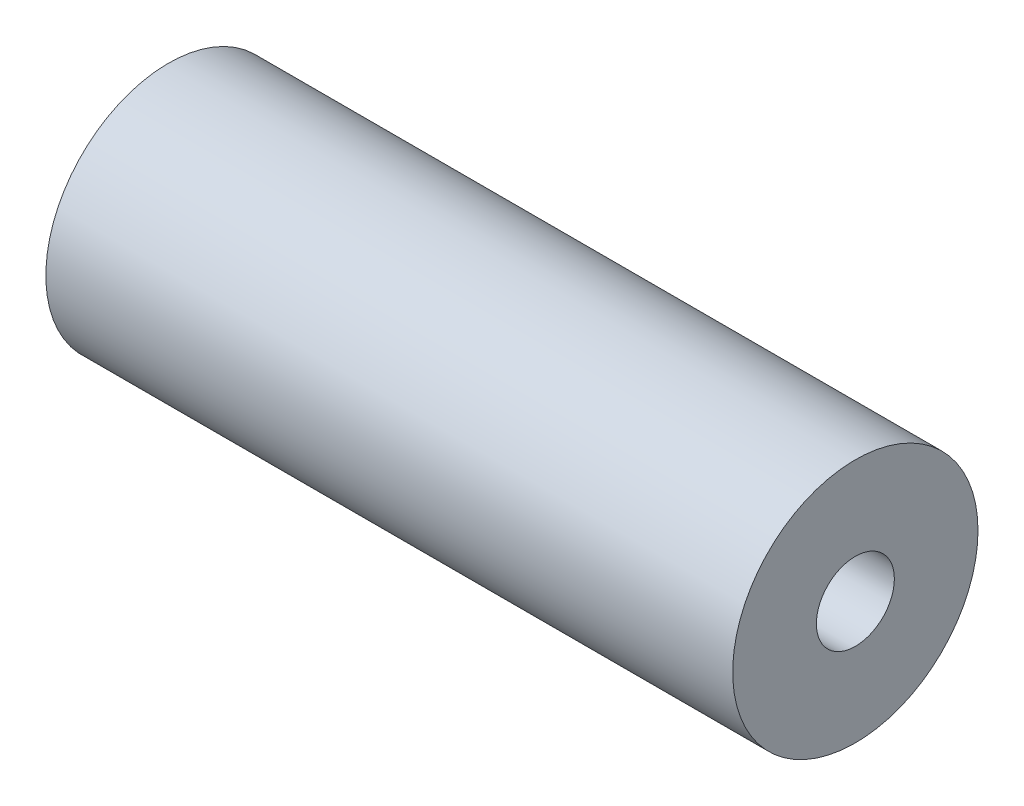
ISO-10303-21;
HEADER;
FILE_DESCRIPTION(('STEP AP214'),'2;1');
FILE_NAME('part.step','',(''),(''),'','','');
FILE_SCHEMA(('AUTOMOTIVE_DESIGN { 1 0 10303 214 1 1 1 1 }'));
ENDSEC;
DATA;
#1=APPLICATION_CONTEXT('core data for automotive mechanical design processes');
#2=APPLICATION_PROTOCOL_DEFINITION('international standard','automotive_design',2000,#1);
#3=PRODUCT_CONTEXT('',#1,'mechanical');
#4=PRODUCT('Part','Part','',(#3));
#5=PRODUCT_RELATED_PRODUCT_CATEGORY('part','',(#4));
#6=PRODUCT_DEFINITION_FORMATION('','',#4);
#7=PRODUCT_DEFINITION_CONTEXT('part definition',#1,'design');
#8=PRODUCT_DEFINITION('design','',#6,#7);
#9=PRODUCT_DEFINITION_SHAPE('','',#8);
#10=(LENGTH_UNIT() NAMED_UNIT(*) SI_UNIT(.MILLI.,.METRE.));
#11=(NAMED_UNIT(*) PLANE_ANGLE_UNIT() SI_UNIT($,.RADIAN.));
#12=(NAMED_UNIT(*) SI_UNIT($,.STERADIAN.) SOLID_ANGLE_UNIT());
#13=UNCERTAINTY_MEASURE_WITH_UNIT(LENGTH_MEASURE(1.E-05),#10,'distance_accuracy_value','');
#14=(GEOMETRIC_REPRESENTATION_CONTEXT(3) GLOBAL_UNCERTAINTY_ASSIGNED_CONTEXT((#13)) GLOBAL_UNIT_ASSIGNED_CONTEXT((#10,
#11,#12)) REPRESENTATION_CONTEXT('',''));
#15=CARTESIAN_POINT('',(0.,0.,0.));
#16=DIRECTION('',(0.,0.,1.));
#17=DIRECTION('',(1.,0.,0.));
#18=AXIS2_PLACEMENT_3D('',#15,#16,#17);
#19=CARTESIAN_POINT('',(17.78,0.,0.));
#20=DIRECTION('',(-1.,0.,0.));
#21=DIRECTION('',(0.,0.,1.));
#22=AXIS2_PLACEMENT_3D('',#19,#20,#21);
#23=CYLINDRICAL_SURFACE('',#22,6.35);
#24=CARTESIAN_POINT('',(17.78,0.,0.));
#25=DIRECTION('',(1.,0.,0.));
#26=DIRECTION('',(0.,0.,-1.));
#27=AXIS2_PLACEMENT_3D('',#24,#25,#26);
#28=CIRCLE('',#27,6.35);
#29=CARTESIAN_POINT('',(17.78,0.,-6.35));
#30=VERTEX_POINT('',#29);
#31=EDGE_CURVE('E11',#30,#30,#28,.T.);
#32=ORIENTED_EDGE('',*,*,#31,.F.);
#33=EDGE_LOOP('',(#32));
#34=FACE_BOUND('',#33,.T.);
#35=CARTESIAN_POINT('',(-17.78,0.,0.));
#36=DIRECTION('',(1.,0.,0.));
#37=DIRECTION('',(0.,0.,-1.));
#38=AXIS2_PLACEMENT_3D('',#35,#36,#37);
#39=CIRCLE('',#38,6.35);
#40=CARTESIAN_POINT('',(-17.78,0.,-6.35));
#41=VERTEX_POINT('',#40);
#42=EDGE_CURVE('E46',#41,#41,#39,.T.);
#43=ORIENTED_EDGE('',*,*,#42,.T.);
#44=EDGE_LOOP('',(#43));
#45=FACE_BOUND('',#44,.T.);
#46=ADVANCED_FACE('F43',(#34,#45),#23,.T.);
#47=CARTESIAN_POINT('',(17.78,0.,0.));
#48=DIRECTION('',(1.,0.,0.));
#49=DIRECTION('',(0.,0.,-1.));
#50=AXIS2_PLACEMENT_3D('',#47,#48,#49);
#51=PLANE('',#50);
#52=CARTESIAN_POINT('',(17.78,0.,0.));
#53=DIRECTION('',(1.,0.,0.));
#54=DIRECTION('',(0.,0.,-1.));
#55=AXIS2_PLACEMENT_3D('',#52,#53,#54);
#56=CIRCLE('',#55,2.01929999999999);
#57=CARTESIAN_POINT('',(17.78,0.,-2.01929999999999));
#58=VERTEX_POINT('',#57);
#59=EDGE_CURVE('E68',#58,#58,#56,.T.);
#60=ORIENTED_EDGE('',*,*,#59,.F.);
#61=EDGE_LOOP('',(#60));
#62=FACE_BOUND('',#61,.T.);
#63=ORIENTED_EDGE('',*,*,#31,.T.);
#64=EDGE_LOOP('',(#63));
#65=FACE_BOUND('',#64,.T.);
#66=ADVANCED_FACE('F91',(#62,#65),#51,.T.);
#67=CARTESIAN_POINT('',(-17.78,0.,0.));
#68=DIRECTION('',(1.,0.,0.));
#69=DIRECTION('',(0.,0.,-1.));
#70=AXIS2_PLACEMENT_3D('',#67,#68,#69);
#71=PLANE('',#70);
#72=CARTESIAN_POINT('',(-17.78,0.,0.));
#73=DIRECTION('',(-1.,0.,0.));
#74=DIRECTION('',(0.,0.,1.));
#75=AXIS2_PLACEMENT_3D('',#72,#73,#74);
#76=CIRCLE('',#75,2.01929999999999);
#77=CARTESIAN_POINT('',(-17.78,0.,2.01929999999999));
#78=VERTEX_POINT('',#77);
#79=EDGE_CURVE('E69',#78,#78,#76,.T.);
#80=ORIENTED_EDGE('',*,*,#79,.F.);
#81=EDGE_LOOP('',(#80));
#82=FACE_BOUND('',#81,.T.);
#83=ORIENTED_EDGE('',*,*,#42,.F.);
#84=EDGE_LOOP('',(#83));
#85=FACE_BOUND('',#84,.T.);
#86=ADVANCED_FACE('F88',(#82,#85),#71,.F.);
#87=CARTESIAN_POINT('',(7.62,0.,0.));
#88=DIRECTION('',(1.,0.,0.));
#89=DIRECTION('',(0.,0.,-1.));
#90=AXIS2_PLACEMENT_3D('',#87,#88,#89);
#91=CONICAL_SURFACE('',#90,2.0193,1.02974425867665);
#92=CARTESIAN_POINT('',(6.40668215199764,0.,0.));
#93=VERTEX_POINT('',#92);
#94=VERTEX_LOOP('',#93);
#95=FACE_BOUND('',#94,.T.);
#96=CARTESIAN_POINT('',(7.62,0.,0.));
#97=DIRECTION('',(1.,0.,0.));
#98=DIRECTION('',(0.,0.,-1.));
#99=AXIS2_PLACEMENT_3D('',#96,#97,#98);
#100=CIRCLE('',#99,2.0193);
#101=CARTESIAN_POINT('',(7.62,0.,-2.0193));
#102=VERTEX_POINT('',#101);
#103=EDGE_CURVE('E74',#102,#102,#100,.T.);
#104=ORIENTED_EDGE('',*,*,#103,.T.);
#105=EDGE_LOOP('',(#104));
#106=FACE_BOUND('',#105,.T.);
#107=ADVANCED_FACE('F90',(#95,#106),#91,.F.);
#108=CARTESIAN_POINT('',(17.78,0.,0.));
#109=DIRECTION('',(1.,0.,0.));
#110=DIRECTION('',(0.,0.,-1.));
#111=AXIS2_PLACEMENT_3D('',#108,#109,#110);
#112=CYLINDRICAL_SURFACE('',#111,2.01929999999999);
#113=ORIENTED_EDGE('',*,*,#103,.F.);
#114=EDGE_LOOP('',(#113));
#115=FACE_BOUND('',#114,.T.);
#116=ORIENTED_EDGE('',*,*,#59,.T.);
#117=EDGE_LOOP('',(#116));
#118=FACE_BOUND('',#117,.T.);
#119=ADVANCED_FACE('F61',(#115,#118),#112,.F.);
#120=CARTESIAN_POINT('',(-7.62,0.,0.));
#121=DIRECTION('',(-1.,0.,0.));
#122=DIRECTION('',(0.,0.,1.));
#123=AXIS2_PLACEMENT_3D('',#120,#121,#122);
#124=CONICAL_SURFACE('',#123,2.0193,1.02974425867665);
#125=CARTESIAN_POINT('',(-6.40668215199764,0.,0.));
#126=VERTEX_POINT('',#125);
#127=VERTEX_LOOP('',#126);
#128=FACE_BOUND('',#127,.T.);
#129=CARTESIAN_POINT('',(-7.62,0.,0.));
#130=DIRECTION('',(-1.,0.,0.));
#131=DIRECTION('',(0.,0.,1.));
#132=AXIS2_PLACEMENT_3D('',#129,#130,#131);
#133=CIRCLE('',#132,2.0193);
#134=CARTESIAN_POINT('',(-7.62,0.,2.0193));
#135=VERTEX_POINT('',#134);
#136=EDGE_CURVE('E65',#135,#135,#133,.T.);
#137=ORIENTED_EDGE('',*,*,#136,.T.);
#138=EDGE_LOOP('',(#137));
#139=FACE_BOUND('',#138,.T.);
#140=ADVANCED_FACE('F57',(#128,#139),#124,.F.);
#141=CARTESIAN_POINT('',(-17.78,0.,0.));
#142=DIRECTION('',(-1.,0.,0.));
#143=DIRECTION('',(0.,0.,1.));
#144=AXIS2_PLACEMENT_3D('',#141,#142,#143);
#145=CYLINDRICAL_SURFACE('',#144,2.01929999999999);
#146=ORIENTED_EDGE('',*,*,#136,.F.);
#147=EDGE_LOOP('',(#146));
#148=FACE_BOUND('',#147,.T.);
#149=ORIENTED_EDGE('',*,*,#79,.T.);
#150=EDGE_LOOP('',(#149));
#151=FACE_BOUND('',#150,.T.);
#152=ADVANCED_FACE('F60',(#148,#151),#145,.F.);
#153=CLOSED_SHELL('',(#46,#66,#86,#107,#119,#140,#152));
#154=MANIFOLD_SOLID_BREP('B2',#153);
#155=ADVANCED_BREP_SHAPE_REPRESENTATION('',(#18,#154),#14);
#156=SHAPE_DEFINITION_REPRESENTATION(#9,#155);
ENDSEC;
END-ISO-10303-21;
